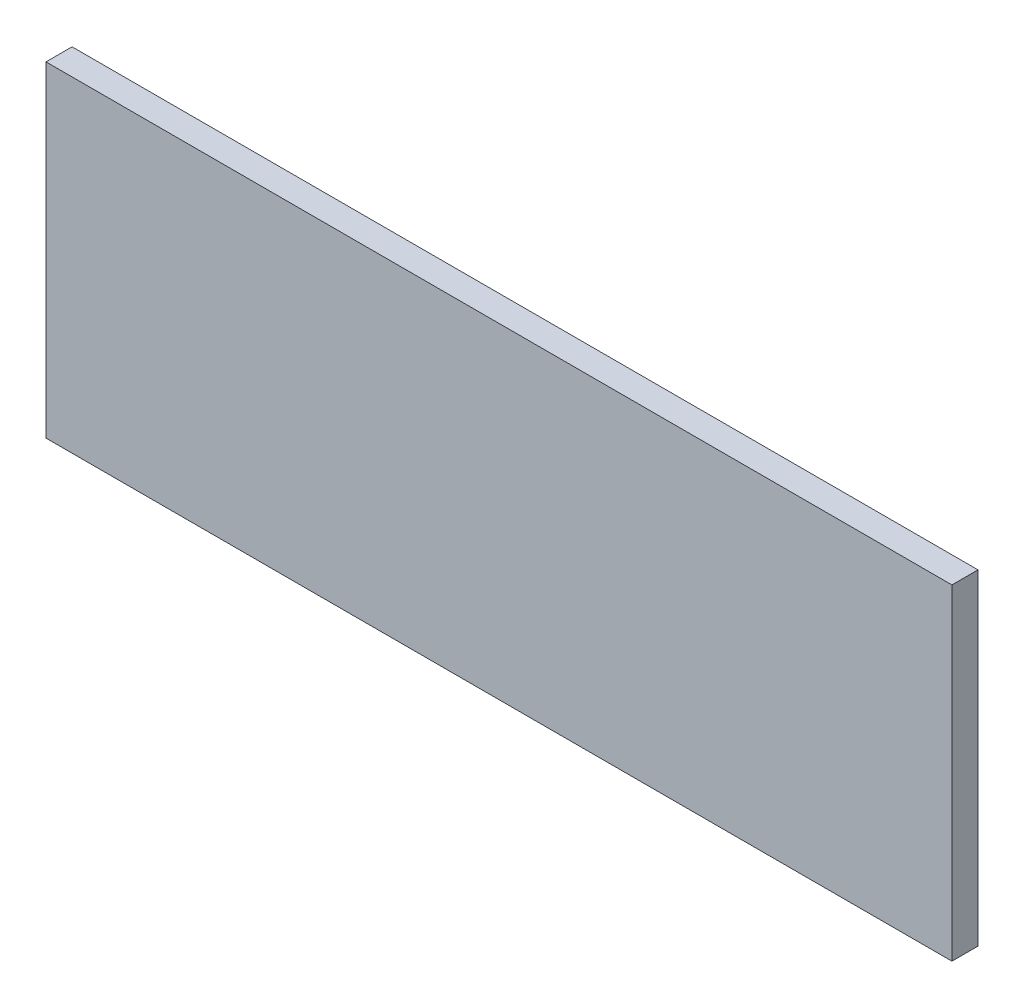
ISO-10303-21;
HEADER;
FILE_DESCRIPTION(('STEP AP214'),'2;1');
FILE_NAME('part.step','',(''),(''),'','','');
FILE_SCHEMA(('AUTOMOTIVE_DESIGN { 1 0 10303 214 1 1 1 1 }'));
ENDSEC;
DATA;
#1=APPLICATION_CONTEXT('core data for automotive mechanical design processes');
#2=APPLICATION_PROTOCOL_DEFINITION('international standard','automotive_design',2000,#1);
#3=PRODUCT_CONTEXT('',#1,'mechanical');
#4=PRODUCT('Part','Part','',(#3));
#5=PRODUCT_RELATED_PRODUCT_CATEGORY('part','',(#4));
#6=PRODUCT_DEFINITION_FORMATION('','',#4);
#7=PRODUCT_DEFINITION_CONTEXT('part definition',#1,'design');
#8=PRODUCT_DEFINITION('design','',#6,#7);
#9=PRODUCT_DEFINITION_SHAPE('','',#8);
#10=(LENGTH_UNIT() NAMED_UNIT(*) SI_UNIT(.MILLI.,.METRE.));
#11=(NAMED_UNIT(*) PLANE_ANGLE_UNIT() SI_UNIT($,.RADIAN.));
#12=(NAMED_UNIT(*) SI_UNIT($,.STERADIAN.) SOLID_ANGLE_UNIT());
#13=UNCERTAINTY_MEASURE_WITH_UNIT(LENGTH_MEASURE(1.E-05),#10,'distance_accuracy_value','');
#14=(GEOMETRIC_REPRESENTATION_CONTEXT(3) GLOBAL_UNCERTAINTY_ASSIGNED_CONTEXT((#13)) GLOBAL_UNIT_ASSIGNED_CONTEXT((#10,
#11,#12)) REPRESENTATION_CONTEXT('',''));
#15=CARTESIAN_POINT('',(0.,0.,0.));
#16=DIRECTION('',(0.,0.,1.));
#17=DIRECTION('',(1.,0.,0.));
#18=AXIS2_PLACEMENT_3D('',#15,#16,#17);
#19=CARTESIAN_POINT('',(0.,0.,4.));
#20=DIRECTION('',(1.,0.,0.));
#21=DIRECTION('',(0.,1.,0.));
#22=AXIS2_PLACEMENT_3D('',#19,#20,#21);
#23=PLANE('',#22);
#24=DIRECTION('',(0.,-1.,0.));
#25=VECTOR('',#24,1.);
#26=CARTESIAN_POINT('',(0.,0.,0.));
#27=LINE('',#26,#25);
#28=CARTESIAN_POINT('',(0.,0.,0.));
#29=VERTEX_POINT('',#28);
#30=CARTESIAN_POINT('',(0.,-50.,0.));
#31=VERTEX_POINT('',#30);
#32=EDGE_CURVE('E115',#29,#31,#27,.T.);
#33=ORIENTED_EDGE('',*,*,#32,.T.);
#34=DIRECTION('',(0.,0.,-1.));
#35=VECTOR('',#34,1.);
#36=CARTESIAN_POINT('',(0.,-50.,4.));
#37=LINE('',#36,#35);
#38=CARTESIAN_POINT('',(0.,-50.,4.));
#39=VERTEX_POINT('',#38);
#40=EDGE_CURVE('E11',#39,#31,#37,.T.);
#41=ORIENTED_EDGE('',*,*,#40,.F.);
#42=DIRECTION('',(0.,-1.,0.));
#43=VECTOR('',#42,1.);
#44=CARTESIAN_POINT('',(0.,0.,4.));
#45=LINE('',#44,#43);
#46=CARTESIAN_POINT('',(0.,0.,4.));
#47=VERTEX_POINT('',#46);
#48=EDGE_CURVE('E97',#47,#39,#45,.T.);
#49=ORIENTED_EDGE('',*,*,#48,.F.);
#50=DIRECTION('',(0.,0.,-1.));
#51=VECTOR('',#50,1.);
#52=CARTESIAN_POINT('',(0.,0.,4.));
#53=LINE('',#52,#51);
#54=EDGE_CURVE('E111',#47,#29,#53,.T.);
#55=ORIENTED_EDGE('',*,*,#54,.T.);
#56=EDGE_LOOP('',(#33,#41,#49,#55));
#57=FACE_BOUND('',#56,.T.);
#58=ADVANCED_FACE('F45',(#57),#23,.F.);
#59=CARTESIAN_POINT('',(0.,-50.,4.));
#60=DIRECTION('',(0.,1.,0.));
#61=DIRECTION('',(0.,0.,1.));
#62=AXIS2_PLACEMENT_3D('',#59,#60,#61);
#63=PLANE('',#62);
#64=DIRECTION('',(1.,0.,0.));
#65=VECTOR('',#64,1.);
#66=CARTESIAN_POINT('',(0.,-50.,0.));
#67=LINE('',#66,#65);
#68=CARTESIAN_POINT('',(139.,-50.,0.));
#69=VERTEX_POINT('',#68);
#70=EDGE_CURVE('E102',#31,#69,#67,.T.);
#71=ORIENTED_EDGE('',*,*,#70,.T.);
#72=DIRECTION('',(0.,0.,-1.));
#73=VECTOR('',#72,1.);
#74=CARTESIAN_POINT('',(139.,-50.,4.));
#75=LINE('',#74,#73);
#76=CARTESIAN_POINT('',(139.,-50.,4.));
#77=VERTEX_POINT('',#76);
#78=EDGE_CURVE('E54',#77,#69,#75,.T.);
#79=ORIENTED_EDGE('',*,*,#78,.F.);
#80=DIRECTION('',(1.,0.,0.));
#81=VECTOR('',#80,1.);
#82=CARTESIAN_POINT('',(0.,-50.,4.));
#83=LINE('',#82,#81);
#84=EDGE_CURVE('E92',#39,#77,#83,.T.);
#85=ORIENTED_EDGE('',*,*,#84,.F.);
#86=ORIENTED_EDGE('',*,*,#40,.T.);
#87=EDGE_LOOP('',(#71,#79,#85,#86));
#88=FACE_BOUND('',#87,.T.);
#89=ADVANCED_FACE('F101',(#88),#63,.F.);
#90=CARTESIAN_POINT('',(139.,0.,4.));
#91=DIRECTION('',(-1.,0.,0.));
#92=DIRECTION('',(0.,0.,1.));
#93=AXIS2_PLACEMENT_3D('',#90,#91,#92);
#94=PLANE('',#93);
#95=DIRECTION('',(0.,1.,0.));
#96=VECTOR('',#95,1.);
#97=CARTESIAN_POINT('',(139.,0.,0.));
#98=LINE('',#97,#96);
#99=CARTESIAN_POINT('',(139.,0.,0.));
#100=VERTEX_POINT('',#99);
#101=EDGE_CURVE('E79',#69,#100,#98,.T.);
#102=ORIENTED_EDGE('',*,*,#101,.T.);
#103=DIRECTION('',(0.,0.,-1.));
#104=VECTOR('',#103,1.);
#105=CARTESIAN_POINT('',(139.,0.,4.));
#106=LINE('',#105,#104);
#107=CARTESIAN_POINT('',(139.,0.,4.));
#108=VERTEX_POINT('',#107);
#109=EDGE_CURVE('E104',#108,#100,#106,.T.);
#110=ORIENTED_EDGE('',*,*,#109,.F.);
#111=DIRECTION('',(0.,1.,0.));
#112=VECTOR('',#111,1.);
#113=CARTESIAN_POINT('',(139.,0.,4.));
#114=LINE('',#113,#112);
#115=EDGE_CURVE('E95',#77,#108,#114,.T.);
#116=ORIENTED_EDGE('',*,*,#115,.F.);
#117=ORIENTED_EDGE('',*,*,#78,.T.);
#118=EDGE_LOOP('',(#102,#110,#116,#117));
#119=FACE_BOUND('',#118,.T.);
#120=ADVANCED_FACE('F105',(#119),#94,.F.);
#121=CARTESIAN_POINT('',(0.,0.,4.));
#122=DIRECTION('',(0.,-1.,0.));
#123=DIRECTION('',(0.,0.,-1.));
#124=AXIS2_PLACEMENT_3D('',#121,#122,#123);
#125=PLANE('',#124);
#126=DIRECTION('',(-1.,0.,0.));
#127=VECTOR('',#126,1.);
#128=CARTESIAN_POINT('',(0.,0.,0.));
#129=LINE('',#128,#127);
#130=EDGE_CURVE('E85',#100,#29,#129,.T.);
#131=ORIENTED_EDGE('',*,*,#130,.T.);
#132=ORIENTED_EDGE('',*,*,#54,.F.);
#133=DIRECTION('',(-1.,0.,0.));
#134=VECTOR('',#133,1.);
#135=CARTESIAN_POINT('',(0.,0.,4.));
#136=LINE('',#135,#134);
#137=EDGE_CURVE('E62',#108,#47,#136,.T.);
#138=ORIENTED_EDGE('',*,*,#137,.F.);
#139=ORIENTED_EDGE('',*,*,#109,.T.);
#140=EDGE_LOOP('',(#131,#132,#138,#139));
#141=FACE_BOUND('',#140,.T.);
#142=ADVANCED_FACE('F130',(#141),#125,.F.);
#143=CARTESIAN_POINT('',(0.,0.,4.));
#144=DIRECTION('',(0.,0.,1.));
#145=DIRECTION('',(1.,0.,0.));
#146=AXIS2_PLACEMENT_3D('',#143,#144,#145);
#147=PLANE('',#146);
#148=ORIENTED_EDGE('',*,*,#48,.T.);
#149=ORIENTED_EDGE('',*,*,#84,.T.);
#150=ORIENTED_EDGE('',*,*,#115,.T.);
#151=ORIENTED_EDGE('',*,*,#137,.T.);
#152=EDGE_LOOP('',(#148,#149,#150,#151));
#153=FACE_BOUND('',#152,.T.);
#154=ADVANCED_FACE('F93',(#153),#147,.T.);
#155=CARTESIAN_POINT('',(0.,0.,0.));
#156=DIRECTION('',(0.,0.,1.));
#157=DIRECTION('',(1.,0.,0.));
#158=AXIS2_PLACEMENT_3D('',#155,#156,#157);
#159=PLANE('',#158);
#160=ORIENTED_EDGE('',*,*,#32,.F.);
#161=ORIENTED_EDGE('',*,*,#130,.F.);
#162=ORIENTED_EDGE('',*,*,#101,.F.);
#163=ORIENTED_EDGE('',*,*,#70,.F.);
#164=EDGE_LOOP('',(#160,#161,#162,#163));
#165=FACE_BOUND('',#164,.T.);
#166=ADVANCED_FACE('F133',(#165),#159,.F.);
#167=CLOSED_SHELL('',(#58,#89,#120,#142,#154,#166));
#168=MANIFOLD_SOLID_BREP('B2',#167);
#169=ADVANCED_BREP_SHAPE_REPRESENTATION('',(#18,#168),#14);
#170=SHAPE_DEFINITION_REPRESENTATION(#9,#169);
ENDSEC;
END-ISO-10303-21;
